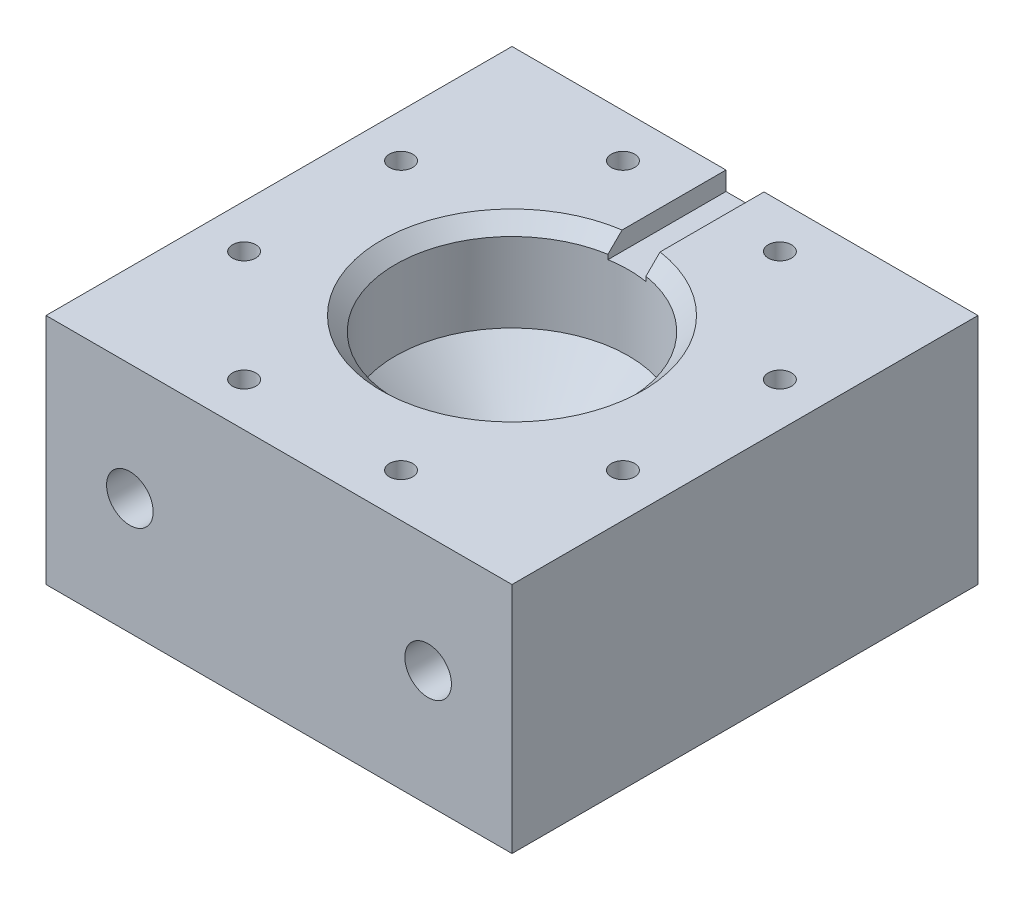
ISO-10303-21;
HEADER;
FILE_DESCRIPTION(('STEP AP214'),'2;1');
FILE_NAME('part.step','',(''),(''),'','','');
FILE_SCHEMA(('AUTOMOTIVE_DESIGN { 1 0 10303 214 1 1 1 1 }'));
ENDSEC;
DATA;
#1=APPLICATION_CONTEXT('core data for automotive mechanical design processes');
#2=APPLICATION_PROTOCOL_DEFINITION('international standard','automotive_design',2000,#1);
#3=PRODUCT_CONTEXT('',#1,'mechanical');
#4=PRODUCT('Part','Part','',(#3));
#5=PRODUCT_RELATED_PRODUCT_CATEGORY('part','',(#4));
#6=PRODUCT_DEFINITION_FORMATION('','',#4);
#7=PRODUCT_DEFINITION_CONTEXT('part definition',#1,'design');
#8=PRODUCT_DEFINITION('design','',#6,#7);
#9=PRODUCT_DEFINITION_SHAPE('','',#8);
#10=(LENGTH_UNIT() NAMED_UNIT(*) SI_UNIT(.MILLI.,.METRE.));
#11=(NAMED_UNIT(*) PLANE_ANGLE_UNIT() SI_UNIT($,.RADIAN.));
#12=(NAMED_UNIT(*) SI_UNIT($,.STERADIAN.) SOLID_ANGLE_UNIT());
#13=UNCERTAINTY_MEASURE_WITH_UNIT(LENGTH_MEASURE(1.E-05),#10,'distance_accuracy_value','');
#14=(GEOMETRIC_REPRESENTATION_CONTEXT(3) GLOBAL_UNCERTAINTY_ASSIGNED_CONTEXT((#13)) GLOBAL_UNIT_ASSIGNED_CONTEXT((#10,
#11,#12)) REPRESENTATION_CONTEXT('',''));
#15=CARTESIAN_POINT('',(0.,0.,0.));
#16=DIRECTION('',(0.,0.,1.));
#17=DIRECTION('',(1.,0.,0.));
#18=AXIS2_PLACEMENT_3D('',#15,#16,#17);
#19=CARTESIAN_POINT('',(25.,25.,-25.));
#20=DIRECTION('',(-1.,0.,0.));
#21=DIRECTION('',(0.,0.,1.));
#22=AXIS2_PLACEMENT_3D('',#19,#20,#21);
#23=PLANE('',#22);
#24=DIRECTION('',(0.,0.,-1.));
#25=VECTOR('',#24,1.);
#26=CARTESIAN_POINT('',(25.,0.,-25.));
#27=LINE('',#26,#25);
#28=CARTESIAN_POINT('',(25.,0.,25.));
#29=VERTEX_POINT('',#28);
#30=CARTESIAN_POINT('',(25.,0.,-25.));
#31=VERTEX_POINT('',#30);
#32=EDGE_CURVE('E252',#29,#31,#27,.T.);
#33=ORIENTED_EDGE('',*,*,#32,.T.);
#34=DIRECTION('',(0.,-1.,0.));
#35=VECTOR('',#34,1.);
#36=CARTESIAN_POINT('',(25.,25.,-25.));
#37=LINE('',#36,#35);
#38=CARTESIAN_POINT('',(25.,25.,-25.));
#39=VERTEX_POINT('',#38);
#40=EDGE_CURVE('E280',#39,#31,#37,.T.);
#41=ORIENTED_EDGE('',*,*,#40,.F.);
#42=DIRECTION('',(0.,0.,-1.));
#43=VECTOR('',#42,1.);
#44=CARTESIAN_POINT('',(25.,25.,-25.));
#45=LINE('',#44,#43);
#46=CARTESIAN_POINT('',(25.,25.,25.));
#47=VERTEX_POINT('',#46);
#48=EDGE_CURVE('E253',#47,#39,#45,.T.);
#49=ORIENTED_EDGE('',*,*,#48,.F.);
#50=DIRECTION('',(0.,-1.,0.));
#51=VECTOR('',#50,1.);
#52=CARTESIAN_POINT('',(25.,25.,25.));
#53=LINE('',#52,#51);
#54=EDGE_CURVE('E264',#47,#29,#53,.T.);
#55=ORIENTED_EDGE('',*,*,#54,.T.);
#56=EDGE_LOOP('',(#33,#41,#49,#55));
#57=FACE_BOUND('',#56,.T.);
#58=ADVANCED_FACE('F47',(#57),#23,.F.);
#59=CARTESIAN_POINT('',(-25.,25.,-25.));
#60=DIRECTION('',(0.,0.,1.));
#61=DIRECTION('',(1.,0.,0.));
#62=AXIS2_PLACEMENT_3D('',#59,#60,#61);
#63=PLANE('',#62);
#64=DIRECTION('',(-1.,0.,0.));
#65=VECTOR('',#64,1.);
#66=CARTESIAN_POINT('',(-2.03937237995895,23.,-25.));
#67=LINE('',#66,#65);
#68=CARTESIAN_POINT('',(2.03937237995894,23.,-25.));
#69=VERTEX_POINT('',#68);
#70=CARTESIAN_POINT('',(-2.03937237995895,23.,-25.));
#71=VERTEX_POINT('',#70);
#72=EDGE_CURVE('E158',#69,#71,#67,.T.);
#73=ORIENTED_EDGE('',*,*,#72,.F.);
#74=DIRECTION('',(0.,1.,0.));
#75=VECTOR('',#74,1.);
#76=CARTESIAN_POINT('',(2.03937237995894,23.,-25.));
#77=LINE('',#76,#75);
#78=CARTESIAN_POINT('',(2.03937237995894,25.,-25.));
#79=VERTEX_POINT('',#78);
#80=EDGE_CURVE('E166',#69,#79,#77,.T.);
#81=ORIENTED_EDGE('',*,*,#80,.T.);
#82=DIRECTION('',(-1.,0.,0.));
#83=VECTOR('',#82,1.);
#84=CARTESIAN_POINT('',(-25.,25.,-25.));
#85=LINE('',#84,#83);
#86=EDGE_CURVE('E258',#39,#79,#85,.T.);
#87=ORIENTED_EDGE('',*,*,#86,.F.);
#88=ORIENTED_EDGE('',*,*,#40,.T.);
#89=DIRECTION('',(-1.,0.,0.));
#90=VECTOR('',#89,1.);
#91=CARTESIAN_POINT('',(-25.,0.,-25.));
#92=LINE('',#91,#90);
#93=CARTESIAN_POINT('',(-25.,0.,-25.));
#94=VERTEX_POINT('',#93);
#95=EDGE_CURVE('E267',#31,#94,#92,.T.);
#96=ORIENTED_EDGE('',*,*,#95,.T.);
#97=DIRECTION('',(0.,-1.,0.));
#98=VECTOR('',#97,1.);
#99=CARTESIAN_POINT('',(-25.,25.,-25.));
#100=LINE('',#99,#98);
#101=CARTESIAN_POINT('',(-25.,25.,-25.));
#102=VERTEX_POINT('',#101);
#103=EDGE_CURVE('E277',#102,#94,#100,.T.);
#104=ORIENTED_EDGE('',*,*,#103,.F.);
#105=CARTESIAN_POINT('',(-2.03937237995895,25.,-25.));
#106=VERTEX_POINT('',#105);
#107=EDGE_CURVE('E256',#106,#102,#85,.T.);
#108=ORIENTED_EDGE('',*,*,#107,.F.);
#109=DIRECTION('',(0.,1.,0.));
#110=VECTOR('',#109,1.);
#111=CARTESIAN_POINT('',(-2.03937237995895,23.,-25.));
#112=LINE('',#111,#110);
#113=EDGE_CURVE('E172',#71,#106,#112,.T.);
#114=ORIENTED_EDGE('',*,*,#113,.F.);
#115=EDGE_LOOP('',(#73,#81,#87,#88,#96,#104,#108,#114));
#116=FACE_BOUND('',#115,.T.);
#117=ADVANCED_FACE('F175',(#116),#63,.F.);
#118=CARTESIAN_POINT('',(-25.,25.,-25.));
#119=DIRECTION('',(1.,0.,0.));
#120=DIRECTION('',(0.,0.,-1.));
#121=AXIS2_PLACEMENT_3D('',#118,#119,#120);
#122=PLANE('',#121);
#123=DIRECTION('',(0.,0.,1.));
#124=VECTOR('',#123,1.);
#125=CARTESIAN_POINT('',(-25.,0.,-25.));
#126=LINE('',#125,#124);
#127=CARTESIAN_POINT('',(-25.,0.,25.));
#128=VERTEX_POINT('',#127);
#129=EDGE_CURVE('E269',#94,#128,#126,.T.);
#130=ORIENTED_EDGE('',*,*,#129,.T.);
#131=DIRECTION('',(0.,-1.,0.));
#132=VECTOR('',#131,1.);
#133=CARTESIAN_POINT('',(-25.,25.,25.));
#134=LINE('',#133,#132);
#135=CARTESIAN_POINT('',(-25.,25.,25.));
#136=VERTEX_POINT('',#135);
#137=EDGE_CURVE('E274',#136,#128,#134,.T.);
#138=ORIENTED_EDGE('',*,*,#137,.F.);
#139=DIRECTION('',(0.,0.,1.));
#140=VECTOR('',#139,1.);
#141=CARTESIAN_POINT('',(-25.,25.,-25.));
#142=LINE('',#141,#140);
#143=EDGE_CURVE('E260',#102,#136,#142,.T.);
#144=ORIENTED_EDGE('',*,*,#143,.F.);
#145=ORIENTED_EDGE('',*,*,#103,.T.);
#146=EDGE_LOOP('',(#130,#138,#144,#145));
#147=FACE_BOUND('',#146,.T.);
#148=ADVANCED_FACE('F405',(#147),#122,.F.);
#149=CARTESIAN_POINT('',(-25.,25.,25.));
#150=DIRECTION('',(0.,0.,-1.));
#151=DIRECTION('',(-1.,0.,0.));
#152=AXIS2_PLACEMENT_3D('',#149,#150,#151);
#153=PLANE('',#152);
#154=CARTESIAN_POINT('',(-16.,12.5,25.));
#155=DIRECTION('',(0.,0.,1.));
#156=DIRECTION('',(1.,0.,0.));
#157=AXIS2_PLACEMENT_3D('',#154,#155,#156);
#158=CIRCLE('',#157,2.49999999999999);
#159=CARTESIAN_POINT('',(-13.5,12.5,25.));
#160=VERTEX_POINT('',#159);
#161=EDGE_CURVE('E182',#160,#160,#158,.T.);
#162=ORIENTED_EDGE('',*,*,#161,.F.);
#163=EDGE_LOOP('',(#162));
#164=FACE_BOUND('',#163,.T.);
#165=CARTESIAN_POINT('',(16.,12.5,25.));
#166=DIRECTION('',(0.,0.,1.));
#167=DIRECTION('',(1.,0.,0.));
#168=AXIS2_PLACEMENT_3D('',#165,#166,#167);
#169=CIRCLE('',#168,2.49999999999999);
#170=CARTESIAN_POINT('',(18.5,12.5,25.));
#171=VERTEX_POINT('',#170);
#172=EDGE_CURVE('E189',#171,#171,#169,.T.);
#173=ORIENTED_EDGE('',*,*,#172,.F.);
#174=EDGE_LOOP('',(#173));
#175=FACE_BOUND('',#174,.T.);
#176=DIRECTION('',(1.,0.,0.));
#177=VECTOR('',#176,1.);
#178=CARTESIAN_POINT('',(-25.,0.,25.));
#179=LINE('',#178,#177);
#180=EDGE_CURVE('E257',#128,#29,#179,.T.);
#181=ORIENTED_EDGE('',*,*,#180,.T.);
#182=ORIENTED_EDGE('',*,*,#54,.F.);
#183=DIRECTION('',(1.,0.,0.));
#184=VECTOR('',#183,1.);
#185=CARTESIAN_POINT('',(-25.,25.,25.));
#186=LINE('',#185,#184);
#187=EDGE_CURVE('E262',#136,#47,#186,.T.);
#188=ORIENTED_EDGE('',*,*,#187,.F.);
#189=ORIENTED_EDGE('',*,*,#137,.T.);
#190=EDGE_LOOP('',(#181,#182,#188,#189));
#191=FACE_BOUND('',#190,.T.);
#192=ADVANCED_FACE('F398',(#164,#175,#191),#153,.F.);
#193=CARTESIAN_POINT('',(0.,25.,0.));
#194=DIRECTION('',(0.,1.,0.));
#195=DIRECTION('',(0.,0.,1.));
#196=AXIS2_PLACEMENT_3D('',#193,#194,#195);
#197=PLANE('',#196);
#198=DIRECTION('',(0.,0.,-1.));
#199=VECTOR('',#198,1.);
#200=CARTESIAN_POINT('',(2.03937237995894,25.,-25.));
#201=LINE('',#200,#199);
#202=CARTESIAN_POINT('',(2.03937237995895,25.,-13.8506664206406));
#203=VERTEX_POINT('',#202);
#204=EDGE_CURVE('E169',#203,#79,#201,.T.);
#205=ORIENTED_EDGE('',*,*,#204,.F.);
#206=CARTESIAN_POINT('',(0.,25.,0.));
#207=DIRECTION('',(0.,1.,0.));
#208=DIRECTION('',(0.,0.,1.));
#209=AXIS2_PLACEMENT_3D('',#206,#207,#208);
#210=CIRCLE('',#209,14.);
#211=CARTESIAN_POINT('',(-2.03937237995894,25.,-13.8506664206406));
#212=VERTEX_POINT('',#211);
#213=EDGE_CURVE('E288',#203,#212,#210,.F.);
#214=ORIENTED_EDGE('',*,*,#213,.T.);
#215=DIRECTION('',(0.,0.,1.));
#216=VECTOR('',#215,1.);
#217=CARTESIAN_POINT('',(-2.03937237995895,25.,-25.));
#218=LINE('',#217,#216);
#219=EDGE_CURVE('E163',#106,#212,#218,.T.);
#220=ORIENTED_EDGE('',*,*,#219,.F.);
#221=ORIENTED_EDGE('',*,*,#107,.T.);
#222=ORIENTED_EDGE('',*,*,#143,.T.);
#223=ORIENTED_EDGE('',*,*,#187,.T.);
#224=ORIENTED_EDGE('',*,*,#48,.T.);
#225=ORIENTED_EDGE('',*,*,#86,.T.);
#226=EDGE_LOOP('',(#205,#214,#220,#221,#222,#223,#224,#225));
#227=FACE_BOUND('',#226,.T.);
#228=CARTESIAN_POINT('',(-8.41903551203185,25.,-20.3253497152484));
#229=DIRECTION('',(0.,1.,0.));
#230=DIRECTION('',(0.,0.,1.));
#231=AXIS2_PLACEMENT_3D('',#228,#229,#230);
#232=CIRCLE('',#231,1.25);
#233=CARTESIAN_POINT('',(-8.41903551203185,25.,-19.0753497152484));
#234=VERTEX_POINT('',#233);
#235=EDGE_CURVE('E195',#234,#234,#232,.T.);
#236=ORIENTED_EDGE('',*,*,#235,.F.);
#237=EDGE_LOOP('',(#236));
#238=FACE_BOUND('',#237,.T.);
#239=CARTESIAN_POINT('',(8.4190355120321,25.,-20.3253497152484));
#240=DIRECTION('',(0.,1.,0.));
#241=DIRECTION('',(0.,0.,1.));
#242=AXIS2_PLACEMENT_3D('',#239,#240,#241);
#243=CIRCLE('',#242,1.25);
#244=CARTESIAN_POINT('',(8.4190355120321,25.,-19.0753497152484));
#245=VERTEX_POINT('',#244);
#246=EDGE_CURVE('E201',#245,#245,#243,.T.);
#247=ORIENTED_EDGE('',*,*,#246,.F.);
#248=EDGE_LOOP('',(#247));
#249=FACE_BOUND('',#248,.T.);
#250=CARTESIAN_POINT('',(20.3253497152484,25.,-8.41903551203202));
#251=DIRECTION('',(0.,1.,0.));
#252=DIRECTION('',(0.,0.,1.));
#253=AXIS2_PLACEMENT_3D('',#250,#251,#252);
#254=CIRCLE('',#253,1.25);
#255=CARTESIAN_POINT('',(20.3253497152484,25.,-7.16903551203202));
#256=VERTEX_POINT('',#255);
#257=EDGE_CURVE('E207',#256,#256,#254,.T.);
#258=ORIENTED_EDGE('',*,*,#257,.F.);
#259=EDGE_LOOP('',(#258));
#260=FACE_BOUND('',#259,.T.);
#261=CARTESIAN_POINT('',(20.3253497152484,25.,8.41903551203193));
#262=DIRECTION('',(0.,1.,0.));
#263=DIRECTION('',(0.,0.,1.));
#264=AXIS2_PLACEMENT_3D('',#261,#262,#263);
#265=CIRCLE('',#264,1.25);
#266=CARTESIAN_POINT('',(20.3253497152484,25.,9.66903551203193));
#267=VERTEX_POINT('',#266);
#268=EDGE_CURVE('E213',#267,#267,#265,.T.);
#269=ORIENTED_EDGE('',*,*,#268,.F.);
#270=EDGE_LOOP('',(#269));
#271=FACE_BOUND('',#270,.T.);
#272=CARTESIAN_POINT('',(8.4190355120321,25.,20.3253497152483));
#273=DIRECTION('',(0.,1.,0.));
#274=DIRECTION('',(0.,0.,1.));
#275=AXIS2_PLACEMENT_3D('',#272,#273,#274);
#276=CIRCLE('',#275,1.25);
#277=CARTESIAN_POINT('',(8.4190355120321,25.,21.5753497152483));
#278=VERTEX_POINT('',#277);
#279=EDGE_CURVE('E219',#278,#278,#276,.T.);
#280=ORIENTED_EDGE('',*,*,#279,.F.);
#281=EDGE_LOOP('',(#280));
#282=FACE_BOUND('',#281,.T.);
#283=CARTESIAN_POINT('',(-8.41903551203185,25.,20.3253497152483));
#284=DIRECTION('',(0.,1.,0.));
#285=DIRECTION('',(0.,0.,1.));
#286=AXIS2_PLACEMENT_3D('',#283,#284,#285);
#287=CIRCLE('',#286,1.25);
#288=CARTESIAN_POINT('',(-8.41903551203185,25.,21.5753497152483));
#289=VERTEX_POINT('',#288);
#290=EDGE_CURVE('E225',#289,#289,#287,.T.);
#291=ORIENTED_EDGE('',*,*,#290,.F.);
#292=EDGE_LOOP('',(#291));
#293=FACE_BOUND('',#292,.T.);
#294=CARTESIAN_POINT('',(-20.3253497152482,25.,8.41903551203193));
#295=DIRECTION('',(0.,1.,0.));
#296=DIRECTION('',(0.,0.,1.));
#297=AXIS2_PLACEMENT_3D('',#294,#295,#296);
#298=CIRCLE('',#297,1.25);
#299=CARTESIAN_POINT('',(-20.3253497152482,25.,9.66903551203193));
#300=VERTEX_POINT('',#299);
#301=EDGE_CURVE('E231',#300,#300,#298,.T.);
#302=ORIENTED_EDGE('',*,*,#301,.F.);
#303=EDGE_LOOP('',(#302));
#304=FACE_BOUND('',#303,.T.);
#305=CARTESIAN_POINT('',(-20.3253497152482,25.,-8.41903551203202));
#306=DIRECTION('',(0.,1.,0.));
#307=DIRECTION('',(0.,0.,1.));
#308=AXIS2_PLACEMENT_3D('',#305,#306,#307);
#309=CIRCLE('',#308,1.25);
#310=CARTESIAN_POINT('',(-20.3253497152482,25.,-7.16903551203203));
#311=VERTEX_POINT('',#310);
#312=EDGE_CURVE('E237',#311,#311,#309,.T.);
#313=ORIENTED_EDGE('',*,*,#312,.F.);
#314=EDGE_LOOP('',(#313));
#315=FACE_BOUND('',#314,.T.);
#316=ADVANCED_FACE('F395',(#227,#238,#249,#260,#271,#282,#293,#304,#315),#197,.T.);
#317=CARTESIAN_POINT('',(0.,0.,0.));
#318=DIRECTION('',(0.,1.,0.));
#319=DIRECTION('',(0.,0.,1.));
#320=AXIS2_PLACEMENT_3D('',#317,#318,#319);
#321=PLANE('',#320);
#322=CARTESIAN_POINT('',(0.,0.,0.));
#323=DIRECTION('',(0.,-1.,0.));
#324=DIRECTION('',(0.,0.,-1.));
#325=AXIS2_PLACEMENT_3D('',#322,#323,#324);
#326=CIRCLE('',#325,4.5);
#327=CARTESIAN_POINT('',(0.,0.,-4.5));
#328=VERTEX_POINT('',#327);
#329=EDGE_CURVE('E249',#328,#328,#326,.T.);
#330=ORIENTED_EDGE('',*,*,#329,.F.);
#331=EDGE_LOOP('',(#330));
#332=FACE_BOUND('',#331,.T.);
#333=ORIENTED_EDGE('',*,*,#32,.F.);
#334=ORIENTED_EDGE('',*,*,#180,.F.);
#335=ORIENTED_EDGE('',*,*,#129,.F.);
#336=ORIENTED_EDGE('',*,*,#95,.F.);
#337=EDGE_LOOP('',(#333,#334,#335,#336));
#338=FACE_BOUND('',#337,.T.);
#339=ADVANCED_FACE('F393',(#332,#338),#321,.F.);
#340=CARTESIAN_POINT('',(0.,0.,0.));
#341=DIRECTION('',(0.,-1.,0.));
#342=DIRECTION('',(0.,0.,-1.));
#343=AXIS2_PLACEMENT_3D('',#340,#341,#342);
#344=CYLINDRICAL_SURFACE('',#343,4.5);
#345=CARTESIAN_POINT('',(0.,7.,0.));
#346=DIRECTION('',(0.,-1.,0.));
#347=DIRECTION('',(0.,0.,-1.));
#348=AXIS2_PLACEMENT_3D('',#345,#346,#347);
#349=CIRCLE('',#348,4.5);
#350=CARTESIAN_POINT('',(0.,7.,-4.5));
#351=VERTEX_POINT('',#350);
#352=EDGE_CURVE('E246',#351,#351,#349,.T.);
#353=ORIENTED_EDGE('',*,*,#352,.F.);
#354=EDGE_LOOP('',(#353));
#355=FACE_BOUND('',#354,.T.);
#356=ORIENTED_EDGE('',*,*,#329,.T.);
#357=EDGE_LOOP('',(#356));
#358=FACE_BOUND('',#357,.T.);
#359=ADVANCED_FACE('F389',(#355,#358),#344,.F.);
#360=CARTESIAN_POINT('',(0.,7.,0.));
#361=DIRECTION('',(0.,1.,0.));
#362=DIRECTION('',(0.,0.,1.));
#363=AXIS2_PLACEMENT_3D('',#360,#361,#362);
#364=CONICAL_SURFACE('',#363,4.5,0.78539816339745);
#365=CARTESIAN_POINT('',(0.,15.,0.));
#366=DIRECTION('',(0.,-1.,0.));
#367=DIRECTION('',(0.,0.,-1.));
#368=AXIS2_PLACEMENT_3D('',#365,#366,#367);
#369=CIRCLE('',#368,12.5);
#370=CARTESIAN_POINT('',(0.,15.,-12.5));
#371=VERTEX_POINT('',#370);
#372=EDGE_CURVE('E243',#371,#371,#369,.T.);
#373=ORIENTED_EDGE('',*,*,#372,.F.);
#374=EDGE_LOOP('',(#373));
#375=FACE_BOUND('',#374,.T.);
#376=ORIENTED_EDGE('',*,*,#352,.T.);
#377=EDGE_LOOP('',(#376));
#378=FACE_BOUND('',#377,.T.);
#379=ADVANCED_FACE('F386',(#375,#378),#364,.F.);
#380=CARTESIAN_POINT('',(0.,0.,0.));
#381=DIRECTION('',(0.,-1.,0.));
#382=DIRECTION('',(0.,0.,-1.));
#383=AXIS2_PLACEMENT_3D('',#380,#381,#382);
#384=CYLINDRICAL_SURFACE('',#383,12.5);
#385=DIRECTION('',(0.,-1.,0.));
#386=VECTOR('',#385,1.);
#387=CARTESIAN_POINT('',(-2.03937237995894,0.,-12.3325163813336));
#388=LINE('',#387,#386);
#389=CARTESIAN_POINT('',(-2.03937237995894,23.,-12.3325163813336));
#390=VERTEX_POINT('',#389);
#391=CARTESIAN_POINT('',(-2.03937237995894,23.5,-12.3325163813336));
#392=VERTEX_POINT('',#391);
#393=EDGE_CURVE('E284',#390,#392,#388,.F.);
#394=ORIENTED_EDGE('',*,*,#393,.T.);
#395=CARTESIAN_POINT('',(0.,23.5,0.));
#396=DIRECTION('',(0.,1.,0.));
#397=DIRECTION('',(0.,0.,1.));
#398=AXIS2_PLACEMENT_3D('',#395,#396,#397);
#399=CIRCLE('',#398,12.5);
#400=CARTESIAN_POINT('',(2.03937237995895,23.5,-12.3325163813336));
#401=VERTEX_POINT('',#400);
#402=EDGE_CURVE('E61',#392,#401,#399,.T.);
#403=ORIENTED_EDGE('',*,*,#402,.T.);
#404=DIRECTION('',(0.,-1.,0.));
#405=VECTOR('',#404,1.);
#406=CARTESIAN_POINT('',(2.03937237995895,0.,-12.3325163813336));
#407=LINE('',#406,#405);
#408=CARTESIAN_POINT('',(2.03937237995895,23.,-12.3325163813336));
#409=VERTEX_POINT('',#408);
#410=EDGE_CURVE('E286',#401,#409,#407,.T.);
#411=ORIENTED_EDGE('',*,*,#410,.T.);
#412=CARTESIAN_POINT('',(0.,23.,0.));
#413=DIRECTION('',(0.,1.,0.));
#414=DIRECTION('',(0.,0.,1.));
#415=AXIS2_PLACEMENT_3D('',#412,#413,#414);
#416=CIRCLE('',#415,12.5);
#417=EDGE_CURVE('E161',#390,#409,#416,.F.);
#418=ORIENTED_EDGE('',*,*,#417,.F.);
#419=EDGE_LOOP('',(#394,#403,#411,#418));
#420=FACE_BOUND('',#419,.T.);
#421=ORIENTED_EDGE('',*,*,#372,.T.);
#422=EDGE_LOOP('',(#421));
#423=FACE_BOUND('',#422,.T.);
#424=ADVANCED_FACE('F382',(#420,#423),#384,.F.);
#425=CARTESIAN_POINT('',(-20.3253497152482,15.,-8.41903551203202));
#426=DIRECTION('',(0.,1.,0.));
#427=DIRECTION('',(0.,0.,1.));
#428=AXIS2_PLACEMENT_3D('',#425,#426,#427);
#429=CONICAL_SURFACE('',#428,1.25,1.02974425867665);
#430=CARTESIAN_POINT('',(-20.3253497152482,14.2489242262155,-8.41903551203202));
#431=VERTEX_POINT('',#430);
#432=VERTEX_LOOP('',#431);
#433=FACE_BOUND('',#432,.T.);
#434=CARTESIAN_POINT('',(-20.3253497152482,15.,-8.41903551203202));
#435=DIRECTION('',(0.,1.,0.));
#436=DIRECTION('',(0.,0.,1.));
#437=AXIS2_PLACEMENT_3D('',#434,#435,#436);
#438=CIRCLE('',#437,1.25);
#439=CARTESIAN_POINT('',(-20.3253497152482,15.,-7.16903551203203));
#440=VERTEX_POINT('',#439);
#441=EDGE_CURVE('E240',#440,#440,#438,.T.);
#442=ORIENTED_EDGE('',*,*,#441,.T.);
#443=EDGE_LOOP('',(#442));
#444=FACE_BOUND('',#443,.T.);
#445=ADVANCED_FACE('F378',(#433,#444),#429,.F.);
#446=CARTESIAN_POINT('',(-20.3253497152482,25.,-8.41903551203202));
#447=DIRECTION('',(0.,1.,0.));
#448=DIRECTION('',(0.,0.,1.));
#449=AXIS2_PLACEMENT_3D('',#446,#447,#448);
#450=CYLINDRICAL_SURFACE('',#449,1.25);
#451=ORIENTED_EDGE('',*,*,#441,.F.);
#452=EDGE_LOOP('',(#451));
#453=FACE_BOUND('',#452,.T.);
#454=ORIENTED_EDGE('',*,*,#312,.T.);
#455=EDGE_LOOP('',(#454));
#456=FACE_BOUND('',#455,.T.);
#457=ADVANCED_FACE('F374',(#453,#456),#450,.F.);
#458=CARTESIAN_POINT('',(-20.3253497152482,15.,8.41903551203193));
#459=DIRECTION('',(0.,1.,0.));
#460=DIRECTION('',(0.,0.,1.));
#461=AXIS2_PLACEMENT_3D('',#458,#459,#460);
#462=CONICAL_SURFACE('',#461,1.25,1.02974425867665);
#463=CARTESIAN_POINT('',(-20.3253497152482,14.2489242262155,8.41903551203193));
#464=VERTEX_POINT('',#463);
#465=VERTEX_LOOP('',#464);
#466=FACE_BOUND('',#465,.T.);
#467=CARTESIAN_POINT('',(-20.3253497152482,15.,8.41903551203193));
#468=DIRECTION('',(0.,1.,0.));
#469=DIRECTION('',(0.,0.,1.));
#470=AXIS2_PLACEMENT_3D('',#467,#468,#469);
#471=CIRCLE('',#470,1.25);
#472=CARTESIAN_POINT('',(-20.3253497152482,15.,9.66903551203193));
#473=VERTEX_POINT('',#472);
#474=EDGE_CURVE('E234',#473,#473,#471,.T.);
#475=ORIENTED_EDGE('',*,*,#474,.T.);
#476=EDGE_LOOP('',(#475));
#477=FACE_BOUND('',#476,.T.);
#478=ADVANCED_FACE('F370',(#466,#477),#462,.F.);
#479=CARTESIAN_POINT('',(-20.3253497152482,25.,8.41903551203193));
#480=DIRECTION('',(0.,1.,0.));
#481=DIRECTION('',(0.,0.,1.));
#482=AXIS2_PLACEMENT_3D('',#479,#480,#481);
#483=CYLINDRICAL_SURFACE('',#482,1.25);
#484=ORIENTED_EDGE('',*,*,#474,.F.);
#485=EDGE_LOOP('',(#484));
#486=FACE_BOUND('',#485,.T.);
#487=ORIENTED_EDGE('',*,*,#301,.T.);
#488=EDGE_LOOP('',(#487));
#489=FACE_BOUND('',#488,.T.);
#490=ADVANCED_FACE('F366',(#486,#489),#483,.F.);
#491=CARTESIAN_POINT('',(-8.41903551203185,15.,20.3253497152483));
#492=DIRECTION('',(0.,1.,0.));
#493=DIRECTION('',(0.,0.,1.));
#494=AXIS2_PLACEMENT_3D('',#491,#492,#493);
#495=CONICAL_SURFACE('',#494,1.25,1.02974425867665);
#496=CARTESIAN_POINT('',(-8.41903551203185,14.2489242262155,20.3253497152483));
#497=VERTEX_POINT('',#496);
#498=VERTEX_LOOP('',#497);
#499=FACE_BOUND('',#498,.T.);
#500=CARTESIAN_POINT('',(-8.41903551203185,15.,20.3253497152483));
#501=DIRECTION('',(0.,1.,0.));
#502=DIRECTION('',(0.,0.,1.));
#503=AXIS2_PLACEMENT_3D('',#500,#501,#502);
#504=CIRCLE('',#503,1.25);
#505=CARTESIAN_POINT('',(-8.41903551203185,15.,21.5753497152483));
#506=VERTEX_POINT('',#505);
#507=EDGE_CURVE('E228',#506,#506,#504,.T.);
#508=ORIENTED_EDGE('',*,*,#507,.T.);
#509=EDGE_LOOP('',(#508));
#510=FACE_BOUND('',#509,.T.);
#511=ADVANCED_FACE('F362',(#499,#510),#495,.F.);
#512=CARTESIAN_POINT('',(-8.41903551203185,25.,20.3253497152483));
#513=DIRECTION('',(0.,1.,0.));
#514=DIRECTION('',(0.,0.,1.));
#515=AXIS2_PLACEMENT_3D('',#512,#513,#514);
#516=CYLINDRICAL_SURFACE('',#515,1.25);
#517=ORIENTED_EDGE('',*,*,#507,.F.);
#518=EDGE_LOOP('',(#517));
#519=FACE_BOUND('',#518,.T.);
#520=ORIENTED_EDGE('',*,*,#290,.T.);
#521=EDGE_LOOP('',(#520));
#522=FACE_BOUND('',#521,.T.);
#523=ADVANCED_FACE('F358',(#519,#522),#516,.F.);
#524=CARTESIAN_POINT('',(8.4190355120321,15.,20.3253497152483));
#525=DIRECTION('',(0.,1.,0.));
#526=DIRECTION('',(0.,0.,1.));
#527=AXIS2_PLACEMENT_3D('',#524,#525,#526);
#528=CONICAL_SURFACE('',#527,1.25,1.02974425867665);
#529=CARTESIAN_POINT('',(8.4190355120321,14.2489242262155,20.3253497152483));
#530=VERTEX_POINT('',#529);
#531=VERTEX_LOOP('',#530);
#532=FACE_BOUND('',#531,.T.);
#533=CARTESIAN_POINT('',(8.4190355120321,15.,20.3253497152483));
#534=DIRECTION('',(0.,1.,0.));
#535=DIRECTION('',(0.,0.,1.));
#536=AXIS2_PLACEMENT_3D('',#533,#534,#535);
#537=CIRCLE('',#536,1.25);
#538=CARTESIAN_POINT('',(8.4190355120321,15.,21.5753497152483));
#539=VERTEX_POINT('',#538);
#540=EDGE_CURVE('E222',#539,#539,#537,.T.);
#541=ORIENTED_EDGE('',*,*,#540,.T.);
#542=EDGE_LOOP('',(#541));
#543=FACE_BOUND('',#542,.T.);
#544=ADVANCED_FACE('F354',(#532,#543),#528,.F.);
#545=CARTESIAN_POINT('',(8.4190355120321,25.,20.3253497152483));
#546=DIRECTION('',(0.,1.,0.));
#547=DIRECTION('',(0.,0.,1.));
#548=AXIS2_PLACEMENT_3D('',#545,#546,#547);
#549=CYLINDRICAL_SURFACE('',#548,1.25);
#550=ORIENTED_EDGE('',*,*,#540,.F.);
#551=EDGE_LOOP('',(#550));
#552=FACE_BOUND('',#551,.T.);
#553=ORIENTED_EDGE('',*,*,#279,.T.);
#554=EDGE_LOOP('',(#553));
#555=FACE_BOUND('',#554,.T.);
#556=ADVANCED_FACE('F350',(#552,#555),#549,.F.);
#557=CARTESIAN_POINT('',(20.3253497152484,15.,8.41903551203193));
#558=DIRECTION('',(0.,1.,0.));
#559=DIRECTION('',(0.,0.,1.));
#560=AXIS2_PLACEMENT_3D('',#557,#558,#559);
#561=CONICAL_SURFACE('',#560,1.25,1.02974425867665);
#562=CARTESIAN_POINT('',(20.3253497152484,14.2489242262155,8.41903551203193));
#563=VERTEX_POINT('',#562);
#564=VERTEX_LOOP('',#563);
#565=FACE_BOUND('',#564,.T.);
#566=CARTESIAN_POINT('',(20.3253497152484,15.,8.41903551203193));
#567=DIRECTION('',(0.,1.,0.));
#568=DIRECTION('',(0.,0.,1.));
#569=AXIS2_PLACEMENT_3D('',#566,#567,#568);
#570=CIRCLE('',#569,1.25);
#571=CARTESIAN_POINT('',(20.3253497152484,15.,9.66903551203193));
#572=VERTEX_POINT('',#571);
#573=EDGE_CURVE('E216',#572,#572,#570,.T.);
#574=ORIENTED_EDGE('',*,*,#573,.T.);
#575=EDGE_LOOP('',(#574));
#576=FACE_BOUND('',#575,.T.);
#577=ADVANCED_FACE('F346',(#565,#576),#561,.F.);
#578=CARTESIAN_POINT('',(20.3253497152484,25.,8.41903551203193));
#579=DIRECTION('',(0.,1.,0.));
#580=DIRECTION('',(0.,0.,1.));
#581=AXIS2_PLACEMENT_3D('',#578,#579,#580);
#582=CYLINDRICAL_SURFACE('',#581,1.25);
#583=ORIENTED_EDGE('',*,*,#573,.F.);
#584=EDGE_LOOP('',(#583));
#585=FACE_BOUND('',#584,.T.);
#586=ORIENTED_EDGE('',*,*,#268,.T.);
#587=EDGE_LOOP('',(#586));
#588=FACE_BOUND('',#587,.T.);
#589=ADVANCED_FACE('F342',(#585,#588),#582,.F.);
#590=CARTESIAN_POINT('',(20.3253497152484,15.,-8.41903551203202));
#591=DIRECTION('',(0.,1.,0.));
#592=DIRECTION('',(0.,0.,1.));
#593=AXIS2_PLACEMENT_3D('',#590,#591,#592);
#594=CONICAL_SURFACE('',#593,1.25,1.02974425867665);
#595=CARTESIAN_POINT('',(20.3253497152484,14.2489242262155,-8.41903551203202));
#596=VERTEX_POINT('',#595);
#597=VERTEX_LOOP('',#596);
#598=FACE_BOUND('',#597,.T.);
#599=CARTESIAN_POINT('',(20.3253497152484,15.,-8.41903551203202));
#600=DIRECTION('',(0.,1.,0.));
#601=DIRECTION('',(0.,0.,1.));
#602=AXIS2_PLACEMENT_3D('',#599,#600,#601);
#603=CIRCLE('',#602,1.25);
#604=CARTESIAN_POINT('',(20.3253497152484,15.,-7.16903551203202));
#605=VERTEX_POINT('',#604);
#606=EDGE_CURVE('E210',#605,#605,#603,.T.);
#607=ORIENTED_EDGE('',*,*,#606,.T.);
#608=EDGE_LOOP('',(#607));
#609=FACE_BOUND('',#608,.T.);
#610=ADVANCED_FACE('F338',(#598,#609),#594,.F.);
#611=CARTESIAN_POINT('',(20.3253497152484,25.,-8.41903551203202));
#612=DIRECTION('',(0.,1.,0.));
#613=DIRECTION('',(0.,0.,1.));
#614=AXIS2_PLACEMENT_3D('',#611,#612,#613);
#615=CYLINDRICAL_SURFACE('',#614,1.25);
#616=ORIENTED_EDGE('',*,*,#606,.F.);
#617=EDGE_LOOP('',(#616));
#618=FACE_BOUND('',#617,.T.);
#619=ORIENTED_EDGE('',*,*,#257,.T.);
#620=EDGE_LOOP('',(#619));
#621=FACE_BOUND('',#620,.T.);
#622=ADVANCED_FACE('F334',(#618,#621),#615,.F.);
#623=CARTESIAN_POINT('',(8.4190355120321,15.,-20.3253497152484));
#624=DIRECTION('',(0.,1.,0.));
#625=DIRECTION('',(0.,0.,1.));
#626=AXIS2_PLACEMENT_3D('',#623,#624,#625);
#627=CONICAL_SURFACE('',#626,1.25,1.02974425867665);
#628=CARTESIAN_POINT('',(8.4190355120321,14.2489242262155,-20.3253497152484));
#629=VERTEX_POINT('',#628);
#630=VERTEX_LOOP('',#629);
#631=FACE_BOUND('',#630,.T.);
#632=CARTESIAN_POINT('',(8.4190355120321,15.,-20.3253497152484));
#633=DIRECTION('',(0.,1.,0.));
#634=DIRECTION('',(0.,0.,1.));
#635=AXIS2_PLACEMENT_3D('',#632,#633,#634);
#636=CIRCLE('',#635,1.25);
#637=CARTESIAN_POINT('',(8.4190355120321,15.,-19.0753497152484));
#638=VERTEX_POINT('',#637);
#639=EDGE_CURVE('E204',#638,#638,#636,.T.);
#640=ORIENTED_EDGE('',*,*,#639,.T.);
#641=EDGE_LOOP('',(#640));
#642=FACE_BOUND('',#641,.T.);
#643=ADVANCED_FACE('F330',(#631,#642),#627,.F.);
#644=CARTESIAN_POINT('',(8.4190355120321,25.,-20.3253497152484));
#645=DIRECTION('',(0.,1.,0.));
#646=DIRECTION('',(0.,0.,1.));
#647=AXIS2_PLACEMENT_3D('',#644,#645,#646);
#648=CYLINDRICAL_SURFACE('',#647,1.25);
#649=ORIENTED_EDGE('',*,*,#639,.F.);
#650=EDGE_LOOP('',(#649));
#651=FACE_BOUND('',#650,.T.);
#652=ORIENTED_EDGE('',*,*,#246,.T.);
#653=EDGE_LOOP('',(#652));
#654=FACE_BOUND('',#653,.T.);
#655=ADVANCED_FACE('F326',(#651,#654),#648,.F.);
#656=CARTESIAN_POINT('',(-8.41903551203185,15.,-20.3253497152484));
#657=DIRECTION('',(0.,1.,0.));
#658=DIRECTION('',(0.,0.,1.));
#659=AXIS2_PLACEMENT_3D('',#656,#657,#658);
#660=CONICAL_SURFACE('',#659,1.25,1.02974425867665);
#661=CARTESIAN_POINT('',(-8.41903551203185,14.2489242262155,-20.3253497152484));
#662=VERTEX_POINT('',#661);
#663=VERTEX_LOOP('',#662);
#664=FACE_BOUND('',#663,.T.);
#665=CARTESIAN_POINT('',(-8.41903551203185,15.,-20.3253497152484));
#666=DIRECTION('',(0.,1.,0.));
#667=DIRECTION('',(0.,0.,1.));
#668=AXIS2_PLACEMENT_3D('',#665,#666,#667);
#669=CIRCLE('',#668,1.25);
#670=CARTESIAN_POINT('',(-8.41903551203185,15.,-19.0753497152484));
#671=VERTEX_POINT('',#670);
#672=EDGE_CURVE('E198',#671,#671,#669,.T.);
#673=ORIENTED_EDGE('',*,*,#672,.T.);
#674=EDGE_LOOP('',(#673));
#675=FACE_BOUND('',#674,.T.);
#676=ADVANCED_FACE('F322',(#664,#675),#660,.F.);
#677=CARTESIAN_POINT('',(-8.41903551203185,25.,-20.3253497152484));
#678=DIRECTION('',(0.,1.,0.));
#679=DIRECTION('',(0.,0.,1.));
#680=AXIS2_PLACEMENT_3D('',#677,#678,#679);
#681=CYLINDRICAL_SURFACE('',#680,1.25);
#682=ORIENTED_EDGE('',*,*,#672,.F.);
#683=EDGE_LOOP('',(#682));
#684=FACE_BOUND('',#683,.T.);
#685=ORIENTED_EDGE('',*,*,#235,.T.);
#686=EDGE_LOOP('',(#685));
#687=FACE_BOUND('',#686,.T.);
#688=ADVANCED_FACE('F318',(#684,#687),#681,.F.);
#689=CARTESIAN_POINT('',(16.,12.5,15.));
#690=DIRECTION('',(0.,0.,1.));
#691=DIRECTION('',(1.,0.,0.));
#692=AXIS2_PLACEMENT_3D('',#689,#690,#691);
#693=CONICAL_SURFACE('',#692,2.49999999999999,1.02974425867665);
#694=CARTESIAN_POINT('',(16.,12.5,13.4978484524311));
#695=VERTEX_POINT('',#694);
#696=VERTEX_LOOP('',#695);
#697=FACE_BOUND('',#696,.T.);
#698=CARTESIAN_POINT('',(16.,12.5,15.));
#699=DIRECTION('',(0.,0.,1.));
#700=DIRECTION('',(1.,0.,0.));
#701=AXIS2_PLACEMENT_3D('',#698,#699,#700);
#702=CIRCLE('',#701,2.49999999999999);
#703=CARTESIAN_POINT('',(18.5,12.5,15.));
#704=VERTEX_POINT('',#703);
#705=EDGE_CURVE('E192',#704,#704,#702,.T.);
#706=ORIENTED_EDGE('',*,*,#705,.T.);
#707=EDGE_LOOP('',(#706));
#708=FACE_BOUND('',#707,.T.);
#709=ADVANCED_FACE('F314',(#697,#708),#693,.F.);
#710=CARTESIAN_POINT('',(16.,12.5,25.));
#711=DIRECTION('',(0.,0.,1.));
#712=DIRECTION('',(1.,0.,0.));
#713=AXIS2_PLACEMENT_3D('',#710,#711,#712);
#714=CYLINDRICAL_SURFACE('',#713,2.49999999999999);
#715=ORIENTED_EDGE('',*,*,#705,.F.);
#716=EDGE_LOOP('',(#715));
#717=FACE_BOUND('',#716,.T.);
#718=ORIENTED_EDGE('',*,*,#172,.T.);
#719=EDGE_LOOP('',(#718));
#720=FACE_BOUND('',#719,.T.);
#721=ADVANCED_FACE('F310',(#717,#720),#714,.F.);
#722=CARTESIAN_POINT('',(-16.,12.5,15.));
#723=DIRECTION('',(0.,0.,1.));
#724=DIRECTION('',(1.,0.,0.));
#725=AXIS2_PLACEMENT_3D('',#722,#723,#724);
#726=CONICAL_SURFACE('',#725,2.49999999999999,1.02974425867665);
#727=CARTESIAN_POINT('',(-16.,12.5,13.4978484524311));
#728=VERTEX_POINT('',#727);
#729=VERTEX_LOOP('',#728);
#730=FACE_BOUND('',#729,.T.);
#731=CARTESIAN_POINT('',(-16.,12.5,15.));
#732=DIRECTION('',(0.,0.,1.));
#733=DIRECTION('',(1.,0.,0.));
#734=AXIS2_PLACEMENT_3D('',#731,#732,#733);
#735=CIRCLE('',#734,2.49999999999999);
#736=CARTESIAN_POINT('',(-13.5,12.5,15.));
#737=VERTEX_POINT('',#736);
#738=EDGE_CURVE('E186',#737,#737,#735,.T.);
#739=ORIENTED_EDGE('',*,*,#738,.T.);
#740=EDGE_LOOP('',(#739));
#741=FACE_BOUND('',#740,.T.);
#742=ADVANCED_FACE('F306',(#730,#741),#726,.F.);
#743=CARTESIAN_POINT('',(-16.,12.5,25.));
#744=DIRECTION('',(0.,0.,1.));
#745=DIRECTION('',(1.,0.,0.));
#746=AXIS2_PLACEMENT_3D('',#743,#744,#745);
#747=CYLINDRICAL_SURFACE('',#746,2.49999999999999);
#748=ORIENTED_EDGE('',*,*,#738,.F.);
#749=EDGE_LOOP('',(#748));
#750=FACE_BOUND('',#749,.T.);
#751=ORIENTED_EDGE('',*,*,#161,.T.);
#752=EDGE_LOOP('',(#751));
#753=FACE_BOUND('',#752,.T.);
#754=ADVANCED_FACE('F303',(#750,#753),#747,.F.);
#755=CARTESIAN_POINT('',(2.03937237995894,23.,-25.));
#756=DIRECTION('',(1.,0.,0.));
#757=DIRECTION('',(0.,0.,-1.));
#758=AXIS2_PLACEMENT_3D('',#755,#756,#757);
#759=PLANE('',#758);
#760=ORIENTED_EDGE('',*,*,#410,.F.);
#761=CARTESIAN_POINT('',(2.03937237995895,23.5,-12.3325163813336));
#762=CARTESIAN_POINT('',(2.03937237995895,23.7498256671537,-12.5857136398773));
#763=CARTESIAN_POINT('',(2.03937237995895,23.9997385015709,-12.8388247732741));
#764=CARTESIAN_POINT('',(2.03937237995895,24.4997385015732,-13.3448747863742));
#765=CARTESIAN_POINT('',(2.03937237995895,24.749825667156,-13.5978136660797));
#766=CARTESIAN_POINT('',(2.03937237995895,25.,-13.8506664206406));
#767=B_SPLINE_CURVE_WITH_KNOTS('',3,(#761,#762,#763,#764,#765,#766),.UNSPECIFIED.,.F.,.F.,(4,2,
4),(0.,1.06709654478993,2.13419307524227),.UNSPECIFIED.);
#768=EDGE_CURVE('E13',#401,#203,#767,.T.);
#769=ORIENTED_EDGE('',*,*,#768,.T.);
#770=ORIENTED_EDGE('',*,*,#204,.T.);
#771=ORIENTED_EDGE('',*,*,#80,.F.);
#772=DIRECTION('',(0.,0.,-1.));
#773=VECTOR('',#772,1.);
#774=CARTESIAN_POINT('',(2.03937237995894,23.,-25.));
#775=LINE('',#774,#773);
#776=EDGE_CURVE('E154',#409,#69,#775,.T.);
#777=ORIENTED_EDGE('',*,*,#776,.F.);
#778=EDGE_LOOP('',(#760,#769,#770,#771,#777));
#779=FACE_BOUND('',#778,.T.);
#780=ADVANCED_FACE('F167',(#779),#759,.F.);
#781=CARTESIAN_POINT('',(-2.03937237995895,23.,-25.));
#782=DIRECTION('',(-1.,0.,0.));
#783=DIRECTION('',(0.,0.,1.));
#784=AXIS2_PLACEMENT_3D('',#781,#782,#783);
#785=PLANE('',#784);
#786=ORIENTED_EDGE('',*,*,#219,.T.);
#787=CARTESIAN_POINT('',(-2.03937237995894,25.,-13.8506664206406));
#788=CARTESIAN_POINT('',(-2.03937237995894,24.749825667156,-13.5978136660797));
#789=CARTESIAN_POINT('',(-2.03937237995894,24.4997385015732,-13.3448747863742));
#790=CARTESIAN_POINT('',(-2.03937237995894,23.9997385015709,-12.8388247732741));
#791=CARTESIAN_POINT('',(-2.03937237995894,23.7498256671537,-12.5857136398773));
#792=CARTESIAN_POINT('',(-2.03937237995894,23.5,-12.3325163813336));
#793=B_SPLINE_CURVE_WITH_KNOTS('',3,(#787,#788,#789,#790,#791,#792),.UNSPECIFIED.,.F.,.F.,(4,2,
4),(0.,1.06709653045235,2.13419307524228),.UNSPECIFIED.);
#794=EDGE_CURVE('E75',#212,#392,#793,.T.);
#795=ORIENTED_EDGE('',*,*,#794,.T.);
#796=ORIENTED_EDGE('',*,*,#393,.F.);
#797=DIRECTION('',(0.,0.,1.));
#798=VECTOR('',#797,1.);
#799=CARTESIAN_POINT('',(-2.03937237995895,23.,-25.));
#800=LINE('',#799,#798);
#801=EDGE_CURVE('E173',#71,#390,#800,.T.);
#802=ORIENTED_EDGE('',*,*,#801,.F.);
#803=ORIENTED_EDGE('',*,*,#113,.T.);
#804=EDGE_LOOP('',(#786,#795,#796,#802,#803));
#805=FACE_BOUND('',#804,.T.);
#806=ADVANCED_FACE('F296',(#805),#785,.F.);
#807=CARTESIAN_POINT('',(0.,23.,0.));
#808=DIRECTION('',(0.,1.,0.));
#809=DIRECTION('',(0.,0.,1.));
#810=AXIS2_PLACEMENT_3D('',#807,#808,#809);
#811=PLANE('',#810);
#812=ORIENTED_EDGE('',*,*,#417,.T.);
#813=ORIENTED_EDGE('',*,*,#776,.T.);
#814=ORIENTED_EDGE('',*,*,#72,.T.);
#815=ORIENTED_EDGE('',*,*,#801,.T.);
#816=EDGE_LOOP('',(#812,#813,#814,#815));
#817=FACE_BOUND('',#816,.T.);
#818=ADVANCED_FACE('F156',(#817),#811,.T.);
#819=CARTESIAN_POINT('',(0.,25.,0.));
#820=DIRECTION('',(0.,1.,0.));
#821=DIRECTION('',(0.,0.,1.));
#822=AXIS2_PLACEMENT_3D('',#819,#820,#821);
#823=CONICAL_SURFACE('',#822,14.,0.785398163397447);
#824=ORIENTED_EDGE('',*,*,#768,.F.);
#825=ORIENTED_EDGE('',*,*,#402,.F.);
#826=ORIENTED_EDGE('',*,*,#794,.F.);
#827=ORIENTED_EDGE('',*,*,#213,.F.);
#828=EDGE_LOOP('',(#824,#825,#826,#827));
#829=FACE_BOUND('',#828,.T.);
#830=ADVANCED_FACE('F49',(#829),#823,.F.);
#831=CLOSED_SHELL('',(#58,#117,#148,#192,#316,#339,#359,#379,#424,#445,#457,#478,#490,#511,#523,
#544,#556,#577,#589,#610,#622,#643,#655,#676,#688,#709,#721,#742,#754,#780,#806,#818,#830));
#832=MANIFOLD_SOLID_BREP('B2',#831);
#833=ADVANCED_BREP_SHAPE_REPRESENTATION('',(#18,#832),#14);
#834=SHAPE_DEFINITION_REPRESENTATION(#9,#833);
ENDSEC;
END-ISO-10303-21;
